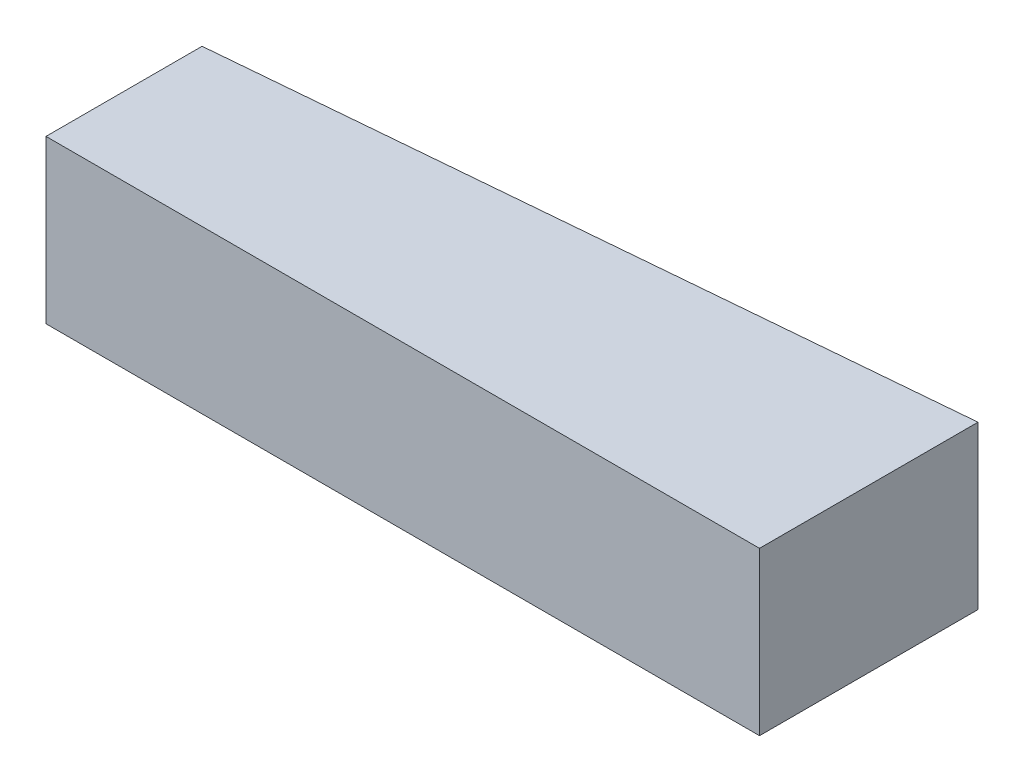
ISO-10303-21;
HEADER;
FILE_DESCRIPTION(('STEP AP214'),'2;1');
FILE_NAME('part.step','',(''),(''),'','','');
FILE_SCHEMA(('AUTOMOTIVE_DESIGN { 1 0 10303 214 1 1 1 1 }'));
ENDSEC;
DATA;
#1=APPLICATION_CONTEXT('core data for automotive mechanical design processes');
#2=APPLICATION_PROTOCOL_DEFINITION('international standard','automotive_design',2000,#1);
#3=PRODUCT_CONTEXT('',#1,'mechanical');
#4=PRODUCT('Part','Part','',(#3));
#5=PRODUCT_RELATED_PRODUCT_CATEGORY('part','',(#4));
#6=PRODUCT_DEFINITION_FORMATION('','',#4);
#7=PRODUCT_DEFINITION_CONTEXT('part definition',#1,'design');
#8=PRODUCT_DEFINITION('design','',#6,#7);
#9=PRODUCT_DEFINITION_SHAPE('','',#8);
#10=(LENGTH_UNIT() NAMED_UNIT(*) SI_UNIT(.MILLI.,.METRE.));
#11=(NAMED_UNIT(*) PLANE_ANGLE_UNIT() SI_UNIT($,.RADIAN.));
#12=(NAMED_UNIT(*) SI_UNIT($,.STERADIAN.) SOLID_ANGLE_UNIT());
#13=UNCERTAINTY_MEASURE_WITH_UNIT(LENGTH_MEASURE(1.E-05),#10,'distance_accuracy_value','');
#14=(GEOMETRIC_REPRESENTATION_CONTEXT(3) GLOBAL_UNCERTAINTY_ASSIGNED_CONTEXT((#13)) GLOBAL_UNIT_ASSIGNED_CONTEXT((#10,
#11,#12)) REPRESENTATION_CONTEXT('',''));
#15=CARTESIAN_POINT('',(0.,0.,0.));
#16=DIRECTION('',(0.,0.,1.));
#17=DIRECTION('',(1.,0.,0.));
#18=AXIS2_PLACEMENT_3D('',#15,#16,#17);
#19=CARTESIAN_POINT('',(11.4300523027622,2.6,0.));
#20=DIRECTION('',(0.,0.,-1.));
#21=DIRECTION('',(-1.,0.,0.));
#22=AXIS2_PLACEMENT_3D('',#19,#20,#21);
#23=PLANE('',#22);
#24=DIRECTION('',(1.,0.,0.));
#25=VECTOR('',#24,1.);
#26=CARTESIAN_POINT('',(11.4300523027622,0.,0.));
#27=LINE('',#26,#25);
#28=CARTESIAN_POINT('',(0.,0.,0.));
#29=VERTEX_POINT('',#28);
#30=CARTESIAN_POINT('',(11.4300523027622,0.,0.));
#31=VERTEX_POINT('',#30);
#32=EDGE_CURVE('E96',#29,#31,#27,.T.);
#33=ORIENTED_EDGE('',*,*,#32,.T.);
#34=DIRECTION('',(0.,-1.,0.));
#35=VECTOR('',#34,1.);
#36=CARTESIAN_POINT('',(11.4300523027622,2.6,0.));
#37=LINE('',#36,#35);
#38=CARTESIAN_POINT('',(11.4300523027622,2.6,0.));
#39=VERTEX_POINT('',#38);
#40=EDGE_CURVE('E11',#39,#31,#37,.T.);
#41=ORIENTED_EDGE('',*,*,#40,.F.);
#42=DIRECTION('',(1.,0.,0.));
#43=VECTOR('',#42,1.);
#44=CARTESIAN_POINT('',(11.4300523027622,2.6,0.));
#45=LINE('',#44,#43);
#46=CARTESIAN_POINT('',(0.,2.6,0.));
#47=VERTEX_POINT('',#46);
#48=EDGE_CURVE('E84',#47,#39,#45,.T.);
#49=ORIENTED_EDGE('',*,*,#48,.F.);
#50=DIRECTION('',(0.,-1.,0.));
#51=VECTOR('',#50,1.);
#52=CARTESIAN_POINT('',(0.,2.6,0.));
#53=LINE('',#52,#51);
#54=EDGE_CURVE('E92',#47,#29,#53,.T.);
#55=ORIENTED_EDGE('',*,*,#54,.T.);
#56=EDGE_LOOP('',(#33,#41,#49,#55));
#57=FACE_BOUND('',#56,.T.);
#58=ADVANCED_FACE('F33',(#57),#23,.F.);
#59=CARTESIAN_POINT('',(11.4300523027622,2.6,-3.5));
#60=DIRECTION('',(-1.,0.,0.));
#61=DIRECTION('',(0.,0.,1.));
#62=AXIS2_PLACEMENT_3D('',#59,#60,#61);
#63=PLANE('',#62);
#64=DIRECTION('',(0.,0.,-1.));
#65=VECTOR('',#64,1.);
#66=CARTESIAN_POINT('',(11.4300523027622,0.,-3.5));
#67=LINE('',#66,#65);
#68=CARTESIAN_POINT('',(11.4300523027622,0.,-3.5));
#69=VERTEX_POINT('',#68);
#70=EDGE_CURVE('E88',#31,#69,#67,.T.);
#71=ORIENTED_EDGE('',*,*,#70,.T.);
#72=DIRECTION('',(0.,-1.,0.));
#73=VECTOR('',#72,1.);
#74=CARTESIAN_POINT('',(11.4300523027622,2.6,-3.5));
#75=LINE('',#74,#73);
#76=CARTESIAN_POINT('',(11.4300523027622,2.6,-3.5));
#77=VERTEX_POINT('',#76);
#78=EDGE_CURVE('E41',#77,#69,#75,.T.);
#79=ORIENTED_EDGE('',*,*,#78,.F.);
#80=DIRECTION('',(0.,0.,-1.));
#81=VECTOR('',#80,1.);
#82=CARTESIAN_POINT('',(11.4300523027622,2.6,-3.5));
#83=LINE('',#82,#81);
#84=EDGE_CURVE('E79',#39,#77,#83,.T.);
#85=ORIENTED_EDGE('',*,*,#84,.F.);
#86=ORIENTED_EDGE('',*,*,#40,.T.);
#87=EDGE_LOOP('',(#71,#79,#85,#86));
#88=FACE_BOUND('',#87,.T.);
#89=ADVANCED_FACE('F87',(#88),#63,.F.);
#90=CARTESIAN_POINT('',(0.,2.6,-2.5));
#91=DIRECTION('',(0.0871557427476517,0.,0.996194698091746));
#92=DIRECTION('',(0.996194698091746,0.,-0.0871557427476517));
#93=AXIS2_PLACEMENT_3D('',#90,#91,#92);
#94=PLANE('',#93);
#95=DIRECTION('',(-0.996194698091746,0.,0.0871557427476517));
#96=VECTOR('',#95,1.);
#97=CARTESIAN_POINT('',(0.,0.,-2.5));
#98=LINE('',#97,#96);
#99=CARTESIAN_POINT('',(0.,0.,-2.5));
#100=VERTEX_POINT('',#99);
#101=EDGE_CURVE('E66',#69,#100,#98,.T.);
#102=ORIENTED_EDGE('',*,*,#101,.T.);
#103=DIRECTION('',(0.,-1.,0.));
#104=VECTOR('',#103,1.);
#105=CARTESIAN_POINT('',(0.,2.6,-2.5));
#106=LINE('',#105,#104);
#107=CARTESIAN_POINT('',(0.,2.6,-2.5));
#108=VERTEX_POINT('',#107);
#109=EDGE_CURVE('E89',#108,#100,#106,.T.);
#110=ORIENTED_EDGE('',*,*,#109,.F.);
#111=DIRECTION('',(-0.996194698091746,0.,0.0871557427476517));
#112=VECTOR('',#111,1.);
#113=CARTESIAN_POINT('',(0.,2.6,-2.5));
#114=LINE('',#113,#112);
#115=EDGE_CURVE('E82',#77,#108,#114,.T.);
#116=ORIENTED_EDGE('',*,*,#115,.F.);
#117=ORIENTED_EDGE('',*,*,#78,.T.);
#118=EDGE_LOOP('',(#102,#110,#116,#117));
#119=FACE_BOUND('',#118,.T.);
#120=ADVANCED_FACE('F90',(#119),#94,.F.);
#121=CARTESIAN_POINT('',(0.,2.6,0.));
#122=DIRECTION('',(1.,0.,0.));
#123=DIRECTION('',(0.,0.,-1.));
#124=AXIS2_PLACEMENT_3D('',#121,#122,#123);
#125=PLANE('',#124);
#126=DIRECTION('',(0.,0.,1.));
#127=VECTOR('',#126,1.);
#128=CARTESIAN_POINT('',(0.,0.,0.));
#129=LINE('',#128,#127);
#130=EDGE_CURVE('E72',#100,#29,#129,.T.);
#131=ORIENTED_EDGE('',*,*,#130,.T.);
#132=ORIENTED_EDGE('',*,*,#54,.F.);
#133=DIRECTION('',(0.,0.,1.));
#134=VECTOR('',#133,1.);
#135=CARTESIAN_POINT('',(0.,2.6,0.));
#136=LINE('',#135,#134);
#137=EDGE_CURVE('E49',#108,#47,#136,.T.);
#138=ORIENTED_EDGE('',*,*,#137,.F.);
#139=ORIENTED_EDGE('',*,*,#109,.T.);
#140=EDGE_LOOP('',(#131,#132,#138,#139));
#141=FACE_BOUND('',#140,.T.);
#142=ADVANCED_FACE('F103',(#141),#125,.F.);
#143=CARTESIAN_POINT('',(0.,2.6,0.));
#144=DIRECTION('',(0.,-1.,0.));
#145=DIRECTION('',(0.,0.,-1.));
#146=AXIS2_PLACEMENT_3D('',#143,#144,#145);
#147=PLANE('',#146);
#148=ORIENTED_EDGE('',*,*,#48,.T.);
#149=ORIENTED_EDGE('',*,*,#84,.T.);
#150=ORIENTED_EDGE('',*,*,#115,.T.);
#151=ORIENTED_EDGE('',*,*,#137,.T.);
#152=EDGE_LOOP('',(#148,#149,#150,#151));
#153=FACE_BOUND('',#152,.T.);
#154=ADVANCED_FACE('F80',(#153),#147,.F.);
#155=CARTESIAN_POINT('',(0.,0.,0.));
#156=DIRECTION('',(0.,-1.,0.));
#157=DIRECTION('',(0.,0.,-1.));
#158=AXIS2_PLACEMENT_3D('',#155,#156,#157);
#159=PLANE('',#158);
#160=ORIENTED_EDGE('',*,*,#32,.F.);
#161=ORIENTED_EDGE('',*,*,#130,.F.);
#162=ORIENTED_EDGE('',*,*,#101,.F.);
#163=ORIENTED_EDGE('',*,*,#70,.F.);
#164=EDGE_LOOP('',(#160,#161,#162,#163));
#165=FACE_BOUND('',#164,.T.);
#166=ADVANCED_FACE('F106',(#165),#159,.T.);
#167=CLOSED_SHELL('',(#58,#89,#120,#142,#154,#166));
#168=MANIFOLD_SOLID_BREP('B2',#167);
#169=ADVANCED_BREP_SHAPE_REPRESENTATION('',(#18,#168),#14);
#170=SHAPE_DEFINITION_REPRESENTATION(#9,#169);
ENDSEC;
END-ISO-10303-21;
